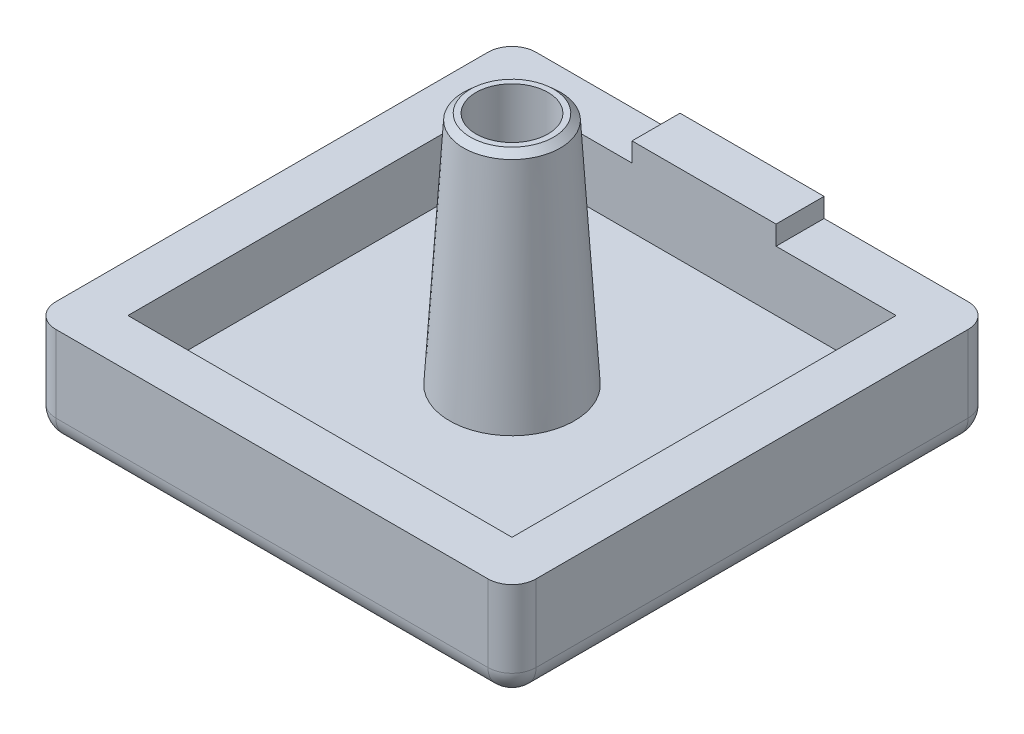
ISO-10303-21;
HEADER;
FILE_DESCRIPTION(('STEP AP214'),'2;1');
FILE_NAME('part.step','',(''),(''),'','','');
FILE_SCHEMA(('AUTOMOTIVE_DESIGN { 1 0 10303 214 1 1 1 1 }'));
ENDSEC;
DATA;
#1=APPLICATION_CONTEXT('core data for automotive mechanical design processes');
#2=APPLICATION_PROTOCOL_DEFINITION('international standard','automotive_design',2000,#1);
#3=PRODUCT_CONTEXT('',#1,'mechanical');
#4=PRODUCT('Part','Part','',(#3));
#5=PRODUCT_RELATED_PRODUCT_CATEGORY('part','',(#4));
#6=PRODUCT_DEFINITION_FORMATION('','',#4);
#7=PRODUCT_DEFINITION_CONTEXT('part definition',#1,'design');
#8=PRODUCT_DEFINITION('design','',#6,#7);
#9=PRODUCT_DEFINITION_SHAPE('','',#8);
#10=(LENGTH_UNIT() NAMED_UNIT(*) SI_UNIT(.MILLI.,.METRE.));
#11=(NAMED_UNIT(*) PLANE_ANGLE_UNIT() SI_UNIT($,.RADIAN.));
#12=(NAMED_UNIT(*) SI_UNIT($,.STERADIAN.) SOLID_ANGLE_UNIT());
#13=UNCERTAINTY_MEASURE_WITH_UNIT(LENGTH_MEASURE(1.E-05),#10,'distance_accuracy_value','');
#14=(GEOMETRIC_REPRESENTATION_CONTEXT(3) GLOBAL_UNCERTAINTY_ASSIGNED_CONTEXT((#13)) GLOBAL_UNIT_ASSIGNED_CONTEXT((#10,
#11,#12)) REPRESENTATION_CONTEXT('',''));
#15=CARTESIAN_POINT('',(0.,0.,0.));
#16=DIRECTION('',(0.,0.,1.));
#17=DIRECTION('',(1.,0.,0.));
#18=AXIS2_PLACEMENT_3D('',#15,#16,#17);
#19=CARTESIAN_POINT('',(0.,1.7,0.));
#20=DIRECTION('',(0.,1.,0.));
#21=DIRECTION('',(0.,0.,1.));
#22=AXIS2_PLACEMENT_3D('',#19,#20,#21);
#23=PLANE('',#22);
#24=CARTESIAN_POINT('',(0.,1.7,0.));
#25=DIRECTION('',(0.,1.,0.));
#26=DIRECTION('',(0.,0.,1.));
#27=AXIS2_PLACEMENT_3D('',#24,#25,#26);
#28=CIRCLE('',#27,1.5);
#29=CARTESIAN_POINT('',(0.,1.7,1.5));
#30=VERTEX_POINT('',#29);
#31=EDGE_CURVE('E20',#30,#30,#28,.T.);
#32=ORIENTED_EDGE('',*,*,#31,.T.);
#33=EDGE_LOOP('',(#32));
#34=FACE_BOUND('',#33,.T.);
#35=ADVANCED_FACE('F17',(#34),#23,.T.);
#36=CARTESIAN_POINT('',(0.,-2.54264068711929,0.));
#37=DIRECTION('',(0.,1.,0.));
#38=DIRECTION('',(0.,0.,1.));
#39=AXIS2_PLACEMENT_3D('',#36,#37,#38);
#40=CYLINDRICAL_SURFACE('',#39,1.5);
#41=CARTESIAN_POINT('',(0.,11.5,0.));
#42=DIRECTION('',(0.,1.,0.));
#43=DIRECTION('',(0.,0.,1.));
#44=AXIS2_PLACEMENT_3D('',#41,#42,#43);
#45=CIRCLE('',#44,1.5);
#46=CARTESIAN_POINT('',(0.,11.5,1.5));
#47=VERTEX_POINT('',#46);
#48=EDGE_CURVE('E281',#47,#47,#45,.F.);
#49=ORIENTED_EDGE('',*,*,#48,.F.);
#50=EDGE_LOOP('',(#49));
#51=FACE_BOUND('',#50,.T.);
#52=ORIENTED_EDGE('',*,*,#31,.F.);
#53=EDGE_LOOP('',(#52));
#54=FACE_BOUND('',#53,.T.);
#55=ADVANCED_FACE('F289',(#51,#54),#40,.F.);
#56=CARTESIAN_POINT('',(0.,11.5,0.));
#57=DIRECTION('',(0.,1.,0.));
#58=DIRECTION('',(0.,0.,1.));
#59=AXIS2_PLACEMENT_3D('',#56,#57,#58);
#60=PLANE('',#59);
#61=ORIENTED_EDGE('',*,*,#48,.T.);
#62=EDGE_LOOP('',(#61));
#63=FACE_BOUND('',#62,.T.);
#64=CARTESIAN_POINT('',(0.,11.5000000000123,0.));
#65=DIRECTION('',(0.,-1.,0.));
#66=DIRECTION('',(0.,0.,-1.));
#67=AXIS2_PLACEMENT_3D('',#64,#65,#66);
#68=CIRCLE('',#67,1.73319700638785);
#69=CARTESIAN_POINT('',(0.,11.5000000000123,-1.73319700638785));
#70=VERTEX_POINT('',#69);
#71=EDGE_CURVE('E273',#70,#70,#68,.T.);
#72=ORIENTED_EDGE('',*,*,#71,.F.);
#73=EDGE_LOOP('',(#72));
#74=FACE_BOUND('',#73,.T.);
#75=ADVANCED_FACE('F291',(#63,#74),#60,.T.);
#76=CARTESIAN_POINT('',(0.,11.2504672416662,0.));
#77=DIRECTION('',(0.,-1.,0.));
#78=DIRECTION('',(0.,0.,-1.));
#79=AXIS2_PLACEMENT_3D('',#76,#77,#78);
#80=CONICAL_SURFACE('',#79,2.01527751579533,0.846546325998921);
#81=CARTESIAN_POINT('',(0.,11.2504672416094,0.));
#82=DIRECTION('',(0.,-1.,0.));
#83=DIRECTION('',(0.,0.,-1.));
#84=AXIS2_PLACEMENT_3D('',#81,#82,#83);
#85=CIRCLE('',#84,2.01527751581665);
#86=CARTESIAN_POINT('',(0.,11.2504672416094,-2.01527751581665));
#87=VERTEX_POINT('',#86);
#88=EDGE_CURVE('E270',#87,#87,#85,.T.);
#89=ORIENTED_EDGE('',*,*,#88,.F.);
#90=EDGE_LOOP('',(#89));
#91=FACE_BOUND('',#90,.T.);
#92=ORIENTED_EDGE('',*,*,#71,.T.);
#93=EDGE_LOOP('',(#92));
#94=FACE_BOUND('',#93,.T.);
#95=ADVANCED_FACE('F298',(#91,#94),#80,.T.);
#96=CARTESIAN_POINT('',(0.,1.69999999997117,0.));
#97=DIRECTION('',(0.,-1.,0.));
#98=DIRECTION('',(0.,0.,-1.));
#99=AXIS2_PLACEMENT_3D('',#96,#97,#98);
#100=CONICAL_SURFACE('',#99,2.59999999999749,0.0611481626495508);
#101=CARTESIAN_POINT('',(0.,1.70000000002801,0.));
#102=DIRECTION('',(0.,-1.,0.));
#103=DIRECTION('',(0.,0.,-1.));
#104=AXIS2_PLACEMENT_3D('',#101,#102,#103);
#105=CIRCLE('',#104,2.59999999999401);
#106=CARTESIAN_POINT('',(0.,1.70000000002801,-2.59999999999401));
#107=VERTEX_POINT('',#106);
#108=EDGE_CURVE('E237',#107,#107,#105,.T.);
#109=ORIENTED_EDGE('',*,*,#108,.F.);
#110=EDGE_LOOP('',(#109));
#111=FACE_BOUND('',#110,.T.);
#112=ORIENTED_EDGE('',*,*,#88,.T.);
#113=EDGE_LOOP('',(#112));
#114=FACE_BOUND('',#113,.T.);
#115=ADVANCED_FACE('F518',(#111,#114),#100,.T.);
#116=CARTESIAN_POINT('',(0.,1.7,0.));
#117=DIRECTION('',(0.,1.,0.));
#118=DIRECTION('',(0.,0.,1.));
#119=AXIS2_PLACEMENT_3D('',#116,#117,#118);
#120=PLANE('',#119);
#121=ORIENTED_EDGE('',*,*,#108,.T.);
#122=EDGE_LOOP('',(#121));
#123=FACE_BOUND('',#122,.T.);
#124=DIRECTION('',(-1.,0.,0.));
#125=VECTOR('',#124,1.);
#126=CARTESIAN_POINT('',(8.,1.7,-8.));
#127=LINE('',#126,#125);
#128=CARTESIAN_POINT('',(8.,1.7,-8.));
#129=VERTEX_POINT('',#128);
#130=CARTESIAN_POINT('',(-8.,1.7,-8.));
#131=VERTEX_POINT('',#130);
#132=EDGE_CURVE('E198',#129,#131,#127,.T.);
#133=ORIENTED_EDGE('',*,*,#132,.T.);
#134=DIRECTION('',(0.,0.,1.));
#135=VECTOR('',#134,1.);
#136=CARTESIAN_POINT('',(-8.,1.7,-8.));
#137=LINE('',#136,#135);
#138=CARTESIAN_POINT('',(-8.,1.7,8.));
#139=VERTEX_POINT('',#138);
#140=EDGE_CURVE('E207',#131,#139,#137,.T.);
#141=ORIENTED_EDGE('',*,*,#140,.T.);
#142=DIRECTION('',(1.,0.,0.));
#143=VECTOR('',#142,1.);
#144=CARTESIAN_POINT('',(-8.,1.7,8.));
#145=LINE('',#144,#143);
#146=CARTESIAN_POINT('',(8.,1.7,8.));
#147=VERTEX_POINT('',#146);
#148=EDGE_CURVE('E213',#139,#147,#145,.T.);
#149=ORIENTED_EDGE('',*,*,#148,.T.);
#150=DIRECTION('',(0.,0.,-1.));
#151=VECTOR('',#150,1.);
#152=CARTESIAN_POINT('',(8.,1.7,8.));
#153=LINE('',#152,#151);
#154=EDGE_CURVE('E216',#147,#129,#153,.T.);
#155=ORIENTED_EDGE('',*,*,#154,.T.);
#156=EDGE_LOOP('',(#133,#141,#149,#155));
#157=FACE_BOUND('',#156,.T.);
#158=ADVANCED_FACE('F514',(#123,#157),#120,.T.);
#159=CARTESIAN_POINT('',(-3.,5.,-10.));
#160=DIRECTION('',(1.,0.,0.));
#161=DIRECTION('',(0.,0.,-1.));
#162=AXIS2_PLACEMENT_3D('',#159,#160,#161);
#163=PLANE('',#162);
#164=DIRECTION('',(0.,1.,0.));
#165=VECTOR('',#164,1.);
#166=CARTESIAN_POINT('',(-3.,1.7,-8.));
#167=LINE('',#166,#165);
#168=CARTESIAN_POINT('',(-3.,4.2,-8.));
#169=VERTEX_POINT('',#168);
#170=CARTESIAN_POINT('',(-3.,5.,-8.));
#171=VERTEX_POINT('',#170);
#172=EDGE_CURVE('E197',#169,#171,#167,.T.);
#173=ORIENTED_EDGE('',*,*,#172,.T.);
#174=DIRECTION('',(0.,0.,1.));
#175=VECTOR('',#174,1.);
#176=CARTESIAN_POINT('',(-3.,5.,0.));
#177=LINE('',#176,#175);
#178=CARTESIAN_POINT('',(-3.,5.,-10.));
#179=VERTEX_POINT('',#178);
#180=EDGE_CURVE('E226',#179,#171,#177,.T.);
#181=ORIENTED_EDGE('',*,*,#180,.F.);
#182=DIRECTION('',(0.,1.,0.));
#183=VECTOR('',#182,1.);
#184=CARTESIAN_POINT('',(-3.,5.,-10.));
#185=LINE('',#184,#183);
#186=CARTESIAN_POINT('',(-3.,4.2,-10.));
#187=VERTEX_POINT('',#186);
#188=EDGE_CURVE('E220',#187,#179,#185,.T.);
#189=ORIENTED_EDGE('',*,*,#188,.F.);
#190=DIRECTION('',(0.,0.,1.));
#191=VECTOR('',#190,1.);
#192=CARTESIAN_POINT('',(-3.,4.2,0.));
#193=LINE('',#192,#191);
#194=EDGE_CURVE('E162',#169,#187,#193,.F.);
#195=ORIENTED_EDGE('',*,*,#194,.F.);
#196=EDGE_LOOP('',(#173,#181,#189,#195));
#197=FACE_BOUND('',#196,.T.);
#198=ADVANCED_FACE('F510',(#197),#163,.F.);
#199=CARTESIAN_POINT('',(3.,5.,-10.));
#200=DIRECTION('',(-1.,0.,0.));
#201=DIRECTION('',(0.,0.,1.));
#202=AXIS2_PLACEMENT_3D('',#199,#200,#201);
#203=PLANE('',#202);
#204=DIRECTION('',(0.,1.,0.));
#205=VECTOR('',#204,1.);
#206=CARTESIAN_POINT('',(3.,5.,-10.));
#207=LINE('',#206,#205);
#208=CARTESIAN_POINT('',(3.,5.,-10.));
#209=VERTEX_POINT('',#208);
#210=CARTESIAN_POINT('',(3.,4.2,-10.));
#211=VERTEX_POINT('',#210);
#212=EDGE_CURVE('E218',#209,#211,#207,.F.);
#213=ORIENTED_EDGE('',*,*,#212,.F.);
#214=DIRECTION('',(0.,0.,1.));
#215=VECTOR('',#214,1.);
#216=CARTESIAN_POINT('',(3.,5.,0.));
#217=LINE('',#216,#215);
#218=CARTESIAN_POINT('',(3.,5.,-8.));
#219=VERTEX_POINT('',#218);
#220=EDGE_CURVE('E254',#219,#209,#217,.F.);
#221=ORIENTED_EDGE('',*,*,#220,.F.);
#222=DIRECTION('',(0.,1.,0.));
#223=VECTOR('',#222,1.);
#224=CARTESIAN_POINT('',(3.,1.7,-8.));
#225=LINE('',#224,#223);
#226=CARTESIAN_POINT('',(3.,4.2,-8.));
#227=VERTEX_POINT('',#226);
#228=EDGE_CURVE('E223',#219,#227,#225,.F.);
#229=ORIENTED_EDGE('',*,*,#228,.T.);
#230=DIRECTION('',(0.,0.,1.));
#231=VECTOR('',#230,1.);
#232=CARTESIAN_POINT('',(3.,4.2,0.));
#233=LINE('',#232,#231);
#234=EDGE_CURVE('E233',#211,#227,#233,.T.);
#235=ORIENTED_EDGE('',*,*,#234,.F.);
#236=EDGE_LOOP('',(#213,#221,#229,#235));
#237=FACE_BOUND('',#236,.T.);
#238=ADVANCED_FACE('F506',(#237),#203,.F.);
#239=CARTESIAN_POINT('',(8.,1.7,8.));
#240=DIRECTION('',(1.,0.,0.));
#241=DIRECTION('',(0.,0.,-1.));
#242=AXIS2_PLACEMENT_3D('',#239,#240,#241);
#243=PLANE('',#242);
#244=DIRECTION('',(0.,1.,0.));
#245=VECTOR('',#244,1.);
#246=CARTESIAN_POINT('',(8.,1.7,-8.));
#247=LINE('',#246,#245);
#248=CARTESIAN_POINT('',(8.,4.2,-8.));
#249=VERTEX_POINT('',#248);
#250=EDGE_CURVE('E201',#249,#129,#247,.F.);
#251=ORIENTED_EDGE('',*,*,#250,.T.);
#252=ORIENTED_EDGE('',*,*,#154,.F.);
#253=DIRECTION('',(0.,1.,0.));
#254=VECTOR('',#253,1.);
#255=CARTESIAN_POINT('',(8.,1.7,8.));
#256=LINE('',#255,#254);
#257=CARTESIAN_POINT('',(8.,4.2,8.));
#258=VERTEX_POINT('',#257);
#259=EDGE_CURVE('E210',#147,#258,#256,.T.);
#260=ORIENTED_EDGE('',*,*,#259,.T.);
#261=DIRECTION('',(0.,0.,1.));
#262=VECTOR('',#261,1.);
#263=CARTESIAN_POINT('',(8.,4.2,0.));
#264=LINE('',#263,#262);
#265=EDGE_CURVE('E232',#249,#258,#264,.T.);
#266=ORIENTED_EDGE('',*,*,#265,.F.);
#267=EDGE_LOOP('',(#251,#252,#260,#266));
#268=FACE_BOUND('',#267,.T.);
#269=ADVANCED_FACE('F502',(#268),#243,.F.);
#270=CARTESIAN_POINT('',(-8.,1.7,8.));
#271=DIRECTION('',(0.,0.,1.));
#272=DIRECTION('',(1.,0.,0.));
#273=AXIS2_PLACEMENT_3D('',#270,#271,#272);
#274=PLANE('',#273);
#275=ORIENTED_EDGE('',*,*,#259,.F.);
#276=ORIENTED_EDGE('',*,*,#148,.F.);
#277=DIRECTION('',(0.,1.,0.));
#278=VECTOR('',#277,1.);
#279=CARTESIAN_POINT('',(-8.,1.7,8.));
#280=LINE('',#279,#278);
#281=CARTESIAN_POINT('',(-8.,4.2,8.));
#282=VERTEX_POINT('',#281);
#283=EDGE_CURVE('E204',#139,#282,#280,.T.);
#284=ORIENTED_EDGE('',*,*,#283,.T.);
#285=DIRECTION('',(1.,0.,0.));
#286=VECTOR('',#285,1.);
#287=CARTESIAN_POINT('',(0.,4.2,8.));
#288=LINE('',#287,#286);
#289=EDGE_CURVE('E363',#258,#282,#288,.F.);
#290=ORIENTED_EDGE('',*,*,#289,.F.);
#291=EDGE_LOOP('',(#275,#276,#284,#290));
#292=FACE_BOUND('',#291,.T.);
#293=ADVANCED_FACE('F498',(#292),#274,.F.);
#294=CARTESIAN_POINT('',(-8.,1.7,-8.));
#295=DIRECTION('',(-1.,0.,0.));
#296=DIRECTION('',(0.,0.,1.));
#297=AXIS2_PLACEMENT_3D('',#294,#295,#296);
#298=PLANE('',#297);
#299=ORIENTED_EDGE('',*,*,#283,.F.);
#300=ORIENTED_EDGE('',*,*,#140,.F.);
#301=DIRECTION('',(0.,1.,0.));
#302=VECTOR('',#301,1.);
#303=CARTESIAN_POINT('',(-8.,1.7,-8.));
#304=LINE('',#303,#302);
#305=CARTESIAN_POINT('',(-8.,4.2,-8.));
#306=VERTEX_POINT('',#305);
#307=EDGE_CURVE('E194',#131,#306,#304,.T.);
#308=ORIENTED_EDGE('',*,*,#307,.T.);
#309=DIRECTION('',(0.,0.,1.));
#310=VECTOR('',#309,1.);
#311=CARTESIAN_POINT('',(-8.,4.2,0.));
#312=LINE('',#311,#310);
#313=EDGE_CURVE('E244',#282,#306,#312,.F.);
#314=ORIENTED_EDGE('',*,*,#313,.F.);
#315=EDGE_LOOP('',(#299,#300,#308,#314));
#316=FACE_BOUND('',#315,.T.);
#317=ADVANCED_FACE('F494',(#316),#298,.F.);
#318=CARTESIAN_POINT('',(8.,1.7,-8.));
#319=DIRECTION('',(0.,0.,-1.));
#320=DIRECTION('',(-1.,0.,0.));
#321=AXIS2_PLACEMENT_3D('',#318,#319,#320);
#322=PLANE('',#321);
#323=ORIENTED_EDGE('',*,*,#228,.F.);
#324=DIRECTION('',(1.,0.,0.));
#325=VECTOR('',#324,1.);
#326=CARTESIAN_POINT('',(0.,5.,-8.));
#327=LINE('',#326,#325);
#328=EDGE_CURVE('E251',#171,#219,#327,.T.);
#329=ORIENTED_EDGE('',*,*,#328,.F.);
#330=ORIENTED_EDGE('',*,*,#172,.F.);
#331=DIRECTION('',(1.,0.,0.));
#332=VECTOR('',#331,1.);
#333=CARTESIAN_POINT('',(0.,4.2,-8.));
#334=LINE('',#333,#332);
#335=EDGE_CURVE('E240',#306,#169,#334,.T.);
#336=ORIENTED_EDGE('',*,*,#335,.F.);
#337=ORIENTED_EDGE('',*,*,#307,.F.);
#338=ORIENTED_EDGE('',*,*,#132,.F.);
#339=ORIENTED_EDGE('',*,*,#250,.F.);
#340=DIRECTION('',(1.,0.,0.));
#341=VECTOR('',#340,1.);
#342=CARTESIAN_POINT('',(0.,4.2,-8.));
#343=LINE('',#342,#341);
#344=EDGE_CURVE('E229',#227,#249,#343,.T.);
#345=ORIENTED_EDGE('',*,*,#344,.F.);
#346=EDGE_LOOP('',(#323,#329,#330,#336,#337,#338,#339,#345));
#347=FACE_BOUND('',#346,.T.);
#348=ADVANCED_FACE('F488',(#347),#322,.F.);
#349=CARTESIAN_POINT('',(-9.,4.2,9.));
#350=DIRECTION('',(0.,-1.,0.));
#351=DIRECTION('',(0.,0.,-1.));
#352=AXIS2_PLACEMENT_3D('',#349,#350,#351);
#353=CYLINDRICAL_SURFACE('',#352,1.);
#354=CARTESIAN_POINT('',(-9.,4.2,9.));
#355=DIRECTION('',(0.,-1.,0.));
#356=DIRECTION('',(0.,0.,-1.));
#357=AXIS2_PLACEMENT_3D('',#354,#355,#356);
#358=CIRCLE('',#357,1.);
#359=CARTESIAN_POINT('',(-10.,4.2,9.));
#360=VERTEX_POINT('',#359);
#361=CARTESIAN_POINT('',(-9.,4.2,10.));
#362=VERTEX_POINT('',#361);
#363=EDGE_CURVE('E155',#360,#362,#358,.F.);
#364=ORIENTED_EDGE('',*,*,#363,.F.);
#365=DIRECTION('',(0.,1.,0.));
#366=VECTOR('',#365,1.);
#367=CARTESIAN_POINT('',(-10.,4.2,9.));
#368=LINE('',#367,#366);
#369=CARTESIAN_POINT('',(-10.,1.,9.));
#370=VERTEX_POINT('',#369);
#371=EDGE_CURVE('E140',#360,#370,#368,.F.);
#372=ORIENTED_EDGE('',*,*,#371,.T.);
#373=CARTESIAN_POINT('',(-9.,1.,9.));
#374=DIRECTION('',(0.,-1.,0.));
#375=DIRECTION('',(1.,0.,0.));
#376=AXIS2_PLACEMENT_3D('',#373,#374,#375);
#377=CIRCLE('',#376,1.);
#378=CARTESIAN_POINT('',(-9.,1.,10.));
#379=VERTEX_POINT('',#378);
#380=EDGE_CURVE('E166',#379,#370,#377,.T.);
#381=ORIENTED_EDGE('',*,*,#380,.F.);
#382=DIRECTION('',(0.,1.,0.));
#383=VECTOR('',#382,1.);
#384=CARTESIAN_POINT('',(-9.,4.2,10.));
#385=LINE('',#384,#383);
#386=EDGE_CURVE('E157',#379,#362,#385,.T.);
#387=ORIENTED_EDGE('',*,*,#386,.T.);
#388=EDGE_LOOP('',(#364,#372,#381,#387));
#389=FACE_BOUND('',#388,.T.);
#390=ADVANCED_FACE('F156',(#389),#353,.T.);
#391=CARTESIAN_POINT('',(9.,4.2,9.00000000000001));
#392=DIRECTION('',(0.,1.,0.));
#393=DIRECTION('',(0.,0.,1.));
#394=AXIS2_PLACEMENT_3D('',#391,#392,#393);
#395=CYLINDRICAL_SURFACE('',#394,0.999999999999999);
#396=CARTESIAN_POINT('',(9.,1.,9.));
#397=DIRECTION('',(0.,-1.,0.));
#398=DIRECTION('',(1.,0.,0.));
#399=AXIS2_PLACEMENT_3D('',#396,#397,#398);
#400=CIRCLE('',#399,1.);
#401=CARTESIAN_POINT('',(10.,1.,9.00000000000001));
#402=VERTEX_POINT('',#401);
#403=CARTESIAN_POINT('',(9.,1.,10.));
#404=VERTEX_POINT('',#403);
#405=EDGE_CURVE('E393',#402,#404,#400,.T.);
#406=ORIENTED_EDGE('',*,*,#405,.F.);
#407=DIRECTION('',(0.,1.,0.));
#408=VECTOR('',#407,1.);
#409=CARTESIAN_POINT('',(10.,4.2,9.));
#410=LINE('',#409,#408);
#411=CARTESIAN_POINT('',(10.,4.2,9.00000000000001));
#412=VERTEX_POINT('',#411);
#413=EDGE_CURVE('E177',#412,#402,#410,.F.);
#414=ORIENTED_EDGE('',*,*,#413,.F.);
#415=CARTESIAN_POINT('',(9.,4.2,9.00000000000001));
#416=DIRECTION('',(0.,1.,0.));
#417=DIRECTION('',(0.,0.,1.));
#418=AXIS2_PLACEMENT_3D('',#415,#416,#417);
#419=CIRCLE('',#418,0.999999999999999);
#420=CARTESIAN_POINT('',(9.,4.2,10.));
#421=VERTEX_POINT('',#420);
#422=EDGE_CURVE('E161',#421,#412,#419,.T.);
#423=ORIENTED_EDGE('',*,*,#422,.F.);
#424=DIRECTION('',(0.,1.,0.));
#425=VECTOR('',#424,1.);
#426=CARTESIAN_POINT('',(9.,4.2,10.));
#427=LINE('',#426,#425);
#428=EDGE_CURVE('E168',#421,#404,#427,.F.);
#429=ORIENTED_EDGE('',*,*,#428,.T.);
#430=EDGE_LOOP('',(#406,#414,#423,#429));
#431=FACE_BOUND('',#430,.T.);
#432=ADVANCED_FACE('F478',(#431),#395,.T.);
#433=CARTESIAN_POINT('',(0.,5.,0.));
#434=DIRECTION('',(0.,1.,0.));
#435=DIRECTION('',(0.,0.,1.));
#436=AXIS2_PLACEMENT_3D('',#433,#434,#435);
#437=PLANE('',#436);
#438=ORIENTED_EDGE('',*,*,#220,.T.);
#439=DIRECTION('',(-1.,0.,0.));
#440=VECTOR('',#439,1.);
#441=CARTESIAN_POINT('',(-10.,5.,-10.));
#442=LINE('',#441,#440);
#443=EDGE_CURVE('E264',#179,#209,#442,.F.);
#444=ORIENTED_EDGE('',*,*,#443,.F.);
#445=ORIENTED_EDGE('',*,*,#180,.T.);
#446=ORIENTED_EDGE('',*,*,#328,.T.);
#447=EDGE_LOOP('',(#438,#444,#445,#446));
#448=FACE_BOUND('',#447,.T.);
#449=ADVANCED_FACE('F480',(#448),#437,.T.);
#450=CARTESIAN_POINT('',(0.,4.2,0.));
#451=DIRECTION('',(0.,1.,0.));
#452=DIRECTION('',(0.,0.,1.));
#453=AXIS2_PLACEMENT_3D('',#450,#451,#452);
#454=PLANE('',#453);
#455=ORIENTED_EDGE('',*,*,#313,.T.);
#456=ORIENTED_EDGE('',*,*,#335,.T.);
#457=ORIENTED_EDGE('',*,*,#194,.T.);
#458=DIRECTION('',(-1.,0.,0.));
#459=VECTOR('',#458,1.);
#460=CARTESIAN_POINT('',(-10.,4.2,-10.));
#461=LINE('',#460,#459);
#462=CARTESIAN_POINT('',(-9.,4.2,-10.));
#463=VERTEX_POINT('',#462);
#464=EDGE_CURVE('E176',#463,#187,#461,.F.);
#465=ORIENTED_EDGE('',*,*,#464,.F.);
#466=CARTESIAN_POINT('',(-9.,4.2,-9.));
#467=DIRECTION('',(0.,1.,0.));
#468=DIRECTION('',(0.,0.,1.));
#469=AXIS2_PLACEMENT_3D('',#466,#467,#468);
#470=CIRCLE('',#469,1.);
#471=CARTESIAN_POINT('',(-10.,4.2,-9.));
#472=VERTEX_POINT('',#471);
#473=EDGE_CURVE('E151',#472,#463,#470,.F.);
#474=ORIENTED_EDGE('',*,*,#473,.F.);
#475=DIRECTION('',(0.,0.,-1.));
#476=VECTOR('',#475,1.);
#477=CARTESIAN_POINT('',(-10.,4.2,-10.));
#478=LINE('',#477,#476);
#479=EDGE_CURVE('E144',#472,#360,#478,.F.);
#480=ORIENTED_EDGE('',*,*,#479,.T.);
#481=ORIENTED_EDGE('',*,*,#363,.T.);
#482=DIRECTION('',(-1.,0.,0.));
#483=VECTOR('',#482,1.);
#484=CARTESIAN_POINT('',(-10.,4.2,10.));
#485=LINE('',#484,#483);
#486=EDGE_CURVE('E413',#362,#421,#485,.F.);
#487=ORIENTED_EDGE('',*,*,#486,.T.);
#488=ORIENTED_EDGE('',*,*,#422,.T.);
#489=DIRECTION('',(0.,0.,-1.));
#490=VECTOR('',#489,1.);
#491=CARTESIAN_POINT('',(10.,4.2,-10.));
#492=LINE('',#491,#490);
#493=CARTESIAN_POINT('',(10.,4.2,-9.));
#494=VERTEX_POINT('',#493);
#495=EDGE_CURVE('E392',#494,#412,#492,.F.);
#496=ORIENTED_EDGE('',*,*,#495,.F.);
#497=CARTESIAN_POINT('',(9.,4.2,-9.));
#498=DIRECTION('',(0.,-1.,0.));
#499=DIRECTION('',(0.,0.,-1.));
#500=AXIS2_PLACEMENT_3D('',#497,#498,#499);
#501=CIRCLE('',#500,1.);
#502=CARTESIAN_POINT('',(9.,4.2,-10.));
#503=VERTEX_POINT('',#502);
#504=EDGE_CURVE('E243',#503,#494,#501,.T.);
#505=ORIENTED_EDGE('',*,*,#504,.F.);
#506=DIRECTION('',(-1.,0.,0.));
#507=VECTOR('',#506,1.);
#508=CARTESIAN_POINT('',(-10.,4.2,-10.));
#509=LINE('',#508,#507);
#510=EDGE_CURVE('E267',#211,#503,#509,.F.);
#511=ORIENTED_EDGE('',*,*,#510,.F.);
#512=ORIENTED_EDGE('',*,*,#234,.T.);
#513=ORIENTED_EDGE('',*,*,#344,.T.);
#514=ORIENTED_EDGE('',*,*,#265,.T.);
#515=ORIENTED_EDGE('',*,*,#289,.T.);
#516=EDGE_LOOP('',(#455,#456,#457,#465,#474,#480,#481,#487,#488,#496,#505,#511,#512,#513,#514,#515));
#517=FACE_BOUND('',#516,.T.);
#518=ADVANCED_FACE('F164',(#517),#454,.T.);
#519=CARTESIAN_POINT('',(9.,4.2,-9.));
#520=DIRECTION('',(0.,-1.,0.));
#521=DIRECTION('',(0.,0.,-1.));
#522=AXIS2_PLACEMENT_3D('',#519,#520,#521);
#523=CYLINDRICAL_SURFACE('',#522,1.);
#524=CARTESIAN_POINT('',(9.,1.,-9.));
#525=DIRECTION('',(0.,-1.,0.));
#526=DIRECTION('',(0.,0.,-1.));
#527=AXIS2_PLACEMENT_3D('',#524,#525,#526);
#528=CIRCLE('',#527,1.);
#529=CARTESIAN_POINT('',(10.,1.,-9.));
#530=VERTEX_POINT('',#529);
#531=CARTESIAN_POINT('',(9.,1.,-10.));
#532=VERTEX_POINT('',#531);
#533=EDGE_CURVE('E275',#530,#532,#528,.F.);
#534=ORIENTED_EDGE('',*,*,#533,.T.);
#535=DIRECTION('',(0.,1.,0.));
#536=VECTOR('',#535,1.);
#537=CARTESIAN_POINT('',(9.,4.2,-10.));
#538=LINE('',#537,#536);
#539=EDGE_CURVE('E367',#503,#532,#538,.F.);
#540=ORIENTED_EDGE('',*,*,#539,.F.);
#541=ORIENTED_EDGE('',*,*,#504,.T.);
#542=DIRECTION('',(0.,1.,0.));
#543=VECTOR('',#542,1.);
#544=CARTESIAN_POINT('',(10.,4.2,-9.));
#545=LINE('',#544,#543);
#546=EDGE_CURVE('E389',#530,#494,#545,.T.);
#547=ORIENTED_EDGE('',*,*,#546,.F.);
#548=EDGE_LOOP('',(#534,#540,#541,#547));
#549=FACE_BOUND('',#548,.T.);
#550=ADVANCED_FACE('F594',(#549),#523,.T.);
#551=CARTESIAN_POINT('',(-9.,4.2,-9.));
#552=DIRECTION('',(0.,1.,0.));
#553=DIRECTION('',(0.,0.,1.));
#554=AXIS2_PLACEMENT_3D('',#551,#552,#553);
#555=CYLINDRICAL_SURFACE('',#554,1.);
#556=CARTESIAN_POINT('',(-9.,1.,-9.));
#557=DIRECTION('',(0.,1.,0.));
#558=DIRECTION('',(1.,0.,0.));
#559=AXIS2_PLACEMENT_3D('',#556,#557,#558);
#560=CIRCLE('',#559,1.);
#561=CARTESIAN_POINT('',(-10.,1.,-9.));
#562=VERTEX_POINT('',#561);
#563=CARTESIAN_POINT('',(-9.,1.,-10.));
#564=VERTEX_POINT('',#563);
#565=EDGE_CURVE('E174',#562,#564,#560,.F.);
#566=ORIENTED_EDGE('',*,*,#565,.F.);
#567=DIRECTION('',(0.,1.,0.));
#568=VECTOR('',#567,1.);
#569=CARTESIAN_POINT('',(-10.,4.2,-9.));
#570=LINE('',#569,#568);
#571=EDGE_CURVE('E150',#562,#472,#570,.T.);
#572=ORIENTED_EDGE('',*,*,#571,.T.);
#573=ORIENTED_EDGE('',*,*,#473,.T.);
#574=DIRECTION('',(0.,1.,0.));
#575=VECTOR('',#574,1.);
#576=CARTESIAN_POINT('',(-9.,4.2,-10.));
#577=LINE('',#576,#575);
#578=EDGE_CURVE('E372',#564,#463,#577,.T.);
#579=ORIENTED_EDGE('',*,*,#578,.F.);
#580=EDGE_LOOP('',(#566,#572,#573,#579));
#581=FACE_BOUND('',#580,.T.);
#582=ADVANCED_FACE('F454',(#581),#555,.T.);
#583=CARTESIAN_POINT('',(-10.,4.2,-10.));
#584=DIRECTION('',(1.,0.,0.));
#585=DIRECTION('',(0.,0.,-1.));
#586=AXIS2_PLACEMENT_3D('',#583,#584,#585);
#587=PLANE('',#586);
#588=ORIENTED_EDGE('',*,*,#571,.F.);
#589=DIRECTION('',(0.,0.,1.));
#590=VECTOR('',#589,1.);
#591=CARTESIAN_POINT('',(-10.,1.,-10.));
#592=LINE('',#591,#590);
#593=EDGE_CURVE('E147',#370,#562,#592,.F.);
#594=ORIENTED_EDGE('',*,*,#593,.F.);
#595=ORIENTED_EDGE('',*,*,#371,.F.);
#596=ORIENTED_EDGE('',*,*,#479,.F.);
#597=EDGE_LOOP('',(#588,#594,#595,#596));
#598=FACE_BOUND('',#597,.T.);
#599=ADVANCED_FACE('F142',(#598),#587,.F.);
#600=CARTESIAN_POINT('',(-9.,1.,9.));
#601=DIRECTION('',(1.,0.,0.));
#602=DIRECTION('',(0.,0.,-1.));
#603=AXIS2_PLACEMENT_3D('',#600,#601,#602);
#604=SPHERICAL_SURFACE('',#603,1.);
#605=ORIENTED_EDGE('',*,*,#380,.T.);
#606=CARTESIAN_POINT('',(-9.,1.,9.));
#607=DIRECTION('',(0.,0.,1.));
#608=DIRECTION('',(1.,0.,0.));
#609=AXIS2_PLACEMENT_3D('',#606,#607,#608);
#610=CIRCLE('',#609,1.);
#611=CARTESIAN_POINT('',(-9.,0.,9.00000000000001));
#612=VERTEX_POINT('',#611);
#613=EDGE_CURVE('E380',#612,#370,#610,.F.);
#614=ORIENTED_EDGE('',*,*,#613,.F.);
#615=CARTESIAN_POINT('',(-9.,1.,9.));
#616=DIRECTION('',(1.,0.,0.));
#617=DIRECTION('',(0.,0.,-1.));
#618=AXIS2_PLACEMENT_3D('',#615,#616,#617);
#619=CIRCLE('',#618,1.);
#620=EDGE_CURVE('E182',#379,#612,#619,.T.);
#621=ORIENTED_EDGE('',*,*,#620,.F.);
#622=EDGE_LOOP('',(#605,#614,#621));
#623=FACE_BOUND('',#622,.T.);
#624=ADVANCED_FACE('F354',(#623),#604,.T.);
#625=CARTESIAN_POINT('',(-10.,4.2,10.));
#626=DIRECTION('',(0.,0.,-1.));
#627=DIRECTION('',(-1.,0.,0.));
#628=AXIS2_PLACEMENT_3D('',#625,#626,#627);
#629=PLANE('',#628);
#630=ORIENTED_EDGE('',*,*,#386,.F.);
#631=DIRECTION('',(1.,0.,0.));
#632=VECTOR('',#631,1.);
#633=CARTESIAN_POINT('',(-10.,1.,10.));
#634=LINE('',#633,#632);
#635=EDGE_CURVE('E423',#404,#379,#634,.F.);
#636=ORIENTED_EDGE('',*,*,#635,.F.);
#637=ORIENTED_EDGE('',*,*,#428,.F.);
#638=ORIENTED_EDGE('',*,*,#486,.F.);
#639=EDGE_LOOP('',(#630,#636,#637,#638));
#640=FACE_BOUND('',#639,.T.);
#641=ADVANCED_FACE('F350',(#640),#629,.F.);
#642=CARTESIAN_POINT('',(9.,1.,9.));
#643=DIRECTION('',(1.,0.,0.));
#644=DIRECTION('',(0.,0.,-1.));
#645=AXIS2_PLACEMENT_3D('',#642,#643,#644);
#646=SPHERICAL_SURFACE('',#645,1.);
#647=CARTESIAN_POINT('',(9.,1.,9.));
#648=DIRECTION('',(1.,0.,0.));
#649=DIRECTION('',(0.,0.,-1.));
#650=AXIS2_PLACEMENT_3D('',#647,#648,#649);
#651=CIRCLE('',#650,1.);
#652=CARTESIAN_POINT('',(9.,0.,9.00000000000001));
#653=VERTEX_POINT('',#652);
#654=EDGE_CURVE('E426',#653,#404,#651,.F.);
#655=ORIENTED_EDGE('',*,*,#654,.F.);
#656=CARTESIAN_POINT('',(9.,1.,9.00000000000001));
#657=DIRECTION('',(0.,0.,-1.));
#658=DIRECTION('',(-1.,0.,0.));
#659=AXIS2_PLACEMENT_3D('',#656,#657,#658);
#660=CIRCLE('',#659,1.);
#661=EDGE_CURVE('E333',#402,#653,#660,.T.);
#662=ORIENTED_EDGE('',*,*,#661,.F.);
#663=ORIENTED_EDGE('',*,*,#405,.T.);
#664=EDGE_LOOP('',(#655,#662,#663));
#665=FACE_BOUND('',#664,.T.);
#666=ADVANCED_FACE('F346',(#665),#646,.T.);
#667=CARTESIAN_POINT('',(10.,4.2,-10.));
#668=DIRECTION('',(1.,0.,0.));
#669=DIRECTION('',(0.,0.,-1.));
#670=AXIS2_PLACEMENT_3D('',#667,#668,#669);
#671=PLANE('',#670);
#672=ORIENTED_EDGE('',*,*,#495,.T.);
#673=ORIENTED_EDGE('',*,*,#413,.T.);
#674=DIRECTION('',(0.,0.,-1.));
#675=VECTOR('',#674,1.);
#676=CARTESIAN_POINT('',(10.,1.,0.));
#677=LINE('',#676,#675);
#678=EDGE_CURVE('E405',#530,#402,#677,.F.);
#679=ORIENTED_EDGE('',*,*,#678,.F.);
#680=ORIENTED_EDGE('',*,*,#546,.T.);
#681=EDGE_LOOP('',(#672,#673,#679,#680));
#682=FACE_BOUND('',#681,.T.);
#683=ADVANCED_FACE('F342',(#682),#671,.T.);
#684=CARTESIAN_POINT('',(-9.,1.,-9.));
#685=DIRECTION('',(1.,0.,0.));
#686=DIRECTION('',(0.,0.,-1.));
#687=AXIS2_PLACEMENT_3D('',#684,#685,#686);
#688=SPHERICAL_SURFACE('',#687,1.);
#689=ORIENTED_EDGE('',*,*,#565,.T.);
#690=CARTESIAN_POINT('',(-9.,1.,-9.));
#691=DIRECTION('',(-1.,0.,0.));
#692=DIRECTION('',(0.,0.,1.));
#693=AXIS2_PLACEMENT_3D('',#690,#691,#692);
#694=CIRCLE('',#693,1.);
#695=CARTESIAN_POINT('',(-9.,0.,-9.));
#696=VERTEX_POINT('',#695);
#697=EDGE_CURVE('E187',#696,#564,#694,.F.);
#698=ORIENTED_EDGE('',*,*,#697,.F.);
#699=CARTESIAN_POINT('',(-9.,1.,-9.));
#700=DIRECTION('',(0.,0.,1.));
#701=DIRECTION('',(1.,0.,0.));
#702=AXIS2_PLACEMENT_3D('',#699,#700,#701);
#703=CIRCLE('',#702,1.);
#704=EDGE_CURVE('E180',#562,#696,#703,.T.);
#705=ORIENTED_EDGE('',*,*,#704,.F.);
#706=EDGE_LOOP('',(#689,#698,#705));
#707=FACE_BOUND('',#706,.T.);
#708=ADVANCED_FACE('F339',(#707),#688,.T.);
#709=CARTESIAN_POINT('',(-10.,4.2,-10.));
#710=DIRECTION('',(0.,0.,-1.));
#711=DIRECTION('',(-1.,0.,0.));
#712=AXIS2_PLACEMENT_3D('',#709,#710,#711);
#713=PLANE('',#712);
#714=DIRECTION('',(-1.,0.,0.));
#715=VECTOR('',#714,1.);
#716=CARTESIAN_POINT('',(0.,1.,-10.));
#717=LINE('',#716,#715);
#718=EDGE_CURVE('E185',#564,#532,#717,.F.);
#719=ORIENTED_EDGE('',*,*,#718,.F.);
#720=ORIENTED_EDGE('',*,*,#578,.T.);
#721=ORIENTED_EDGE('',*,*,#464,.T.);
#722=ORIENTED_EDGE('',*,*,#188,.T.);
#723=ORIENTED_EDGE('',*,*,#443,.T.);
#724=ORIENTED_EDGE('',*,*,#212,.T.);
#725=ORIENTED_EDGE('',*,*,#510,.T.);
#726=ORIENTED_EDGE('',*,*,#539,.T.);
#727=EDGE_LOOP('',(#719,#720,#721,#722,#723,#724,#725,#726));
#728=FACE_BOUND('',#727,.T.);
#729=ADVANCED_FACE('F327',(#728),#713,.T.);
#730=CARTESIAN_POINT('',(9.,1.,-9.));
#731=DIRECTION('',(1.,0.,0.));
#732=DIRECTION('',(0.,0.,-1.));
#733=AXIS2_PLACEMENT_3D('',#730,#731,#732);
#734=SPHERICAL_SURFACE('',#733,1.);
#735=CARTESIAN_POINT('',(9.,1.,-9.));
#736=DIRECTION('',(-1.,0.,0.));
#737=DIRECTION('',(0.,0.,1.));
#738=AXIS2_PLACEMENT_3D('',#735,#736,#737);
#739=CIRCLE('',#738,1.);
#740=CARTESIAN_POINT('',(9.,0.,-9.));
#741=VERTEX_POINT('',#740);
#742=EDGE_CURVE('E34',#532,#741,#739,.T.);
#743=ORIENTED_EDGE('',*,*,#742,.F.);
#744=ORIENTED_EDGE('',*,*,#533,.F.);
#745=CARTESIAN_POINT('',(9.,1.,-9.));
#746=DIRECTION('',(0.,0.,-1.));
#747=DIRECTION('',(-1.,0.,0.));
#748=AXIS2_PLACEMENT_3D('',#745,#746,#747);
#749=CIRCLE('',#748,1.);
#750=EDGE_CURVE('E402',#741,#530,#749,.F.);
#751=ORIENTED_EDGE('',*,*,#750,.F.);
#752=EDGE_LOOP('',(#743,#744,#751));
#753=FACE_BOUND('',#752,.T.);
#754=ADVANCED_FACE('F322',(#753),#734,.T.);
#755=CARTESIAN_POINT('',(-9.,1.,-10.));
#756=DIRECTION('',(0.,0.,1.));
#757=DIRECTION('',(1.,0.,0.));
#758=AXIS2_PLACEMENT_3D('',#755,#756,#757);
#759=CYLINDRICAL_SURFACE('',#758,1.);
#760=ORIENTED_EDGE('',*,*,#704,.T.);
#761=DIRECTION('',(0.,0.,1.));
#762=VECTOR('',#761,1.);
#763=CARTESIAN_POINT('',(-9.,0.,0.));
#764=LINE('',#763,#762);
#765=EDGE_CURVE('E191',#696,#612,#764,.T.);
#766=ORIENTED_EDGE('',*,*,#765,.T.);
#767=ORIENTED_EDGE('',*,*,#613,.T.);
#768=ORIENTED_EDGE('',*,*,#593,.T.);
#769=EDGE_LOOP('',(#760,#766,#767,#768));
#770=FACE_BOUND('',#769,.T.);
#771=ADVANCED_FACE('F318',(#770),#759,.T.);
#772=CARTESIAN_POINT('',(-10.,1.,9.));
#773=DIRECTION('',(1.,0.,0.));
#774=DIRECTION('',(0.,0.,-1.));
#775=AXIS2_PLACEMENT_3D('',#772,#773,#774);
#776=CYLINDRICAL_SURFACE('',#775,1.);
#777=ORIENTED_EDGE('',*,*,#654,.T.);
#778=ORIENTED_EDGE('',*,*,#635,.T.);
#779=ORIENTED_EDGE('',*,*,#620,.T.);
#780=DIRECTION('',(1.,0.,0.));
#781=VECTOR('',#780,1.);
#782=CARTESIAN_POINT('',(0.,0.,9.));
#783=LINE('',#782,#781);
#784=EDGE_CURVE('E465',#612,#653,#783,.T.);
#785=ORIENTED_EDGE('',*,*,#784,.T.);
#786=EDGE_LOOP('',(#777,#778,#779,#785));
#787=FACE_BOUND('',#786,.T.);
#788=ADVANCED_FACE('F314',(#787),#776,.T.);
#789=CARTESIAN_POINT('',(9.,1.,0.));
#790=DIRECTION('',(0.,0.,-1.));
#791=DIRECTION('',(-1.,0.,0.));
#792=AXIS2_PLACEMENT_3D('',#789,#790,#791);
#793=CYLINDRICAL_SURFACE('',#792,1.);
#794=ORIENTED_EDGE('',*,*,#750,.T.);
#795=ORIENTED_EDGE('',*,*,#678,.T.);
#796=ORIENTED_EDGE('',*,*,#661,.T.);
#797=DIRECTION('',(0.,0.,1.));
#798=VECTOR('',#797,1.);
#799=CARTESIAN_POINT('',(9.,0.,0.));
#800=LINE('',#799,#798);
#801=EDGE_CURVE('E26',#653,#741,#800,.F.);
#802=ORIENTED_EDGE('',*,*,#801,.T.);
#803=EDGE_LOOP('',(#794,#795,#796,#802));
#804=FACE_BOUND('',#803,.T.);
#805=ADVANCED_FACE('F308',(#804),#793,.T.);
#806=CARTESIAN_POINT('',(0.,1.,-9.));
#807=DIRECTION('',(-1.,0.,0.));
#808=DIRECTION('',(0.,0.,1.));
#809=AXIS2_PLACEMENT_3D('',#806,#807,#808);
#810=CYLINDRICAL_SURFACE('',#809,1.);
#811=ORIENTED_EDGE('',*,*,#742,.T.);
#812=DIRECTION('',(1.,0.,0.));
#813=VECTOR('',#812,1.);
#814=CARTESIAN_POINT('',(0.,0.,-9.));
#815=LINE('',#814,#813);
#816=EDGE_CURVE('E10',#741,#696,#815,.F.);
#817=ORIENTED_EDGE('',*,*,#816,.T.);
#818=ORIENTED_EDGE('',*,*,#697,.T.);
#819=ORIENTED_EDGE('',*,*,#718,.T.);
#820=EDGE_LOOP('',(#811,#817,#818,#819));
#821=FACE_BOUND('',#820,.T.);
#822=ADVANCED_FACE('F302',(#821),#810,.T.);
#823=CARTESIAN_POINT('',(0.,0.,0.));
#824=DIRECTION('',(0.,1.,0.));
#825=DIRECTION('',(0.,0.,1.));
#826=AXIS2_PLACEMENT_3D('',#823,#824,#825);
#827=PLANE('',#826);
#828=ORIENTED_EDGE('',*,*,#801,.F.);
#829=ORIENTED_EDGE('',*,*,#784,.F.);
#830=ORIENTED_EDGE('',*,*,#765,.F.);
#831=ORIENTED_EDGE('',*,*,#816,.F.);
#832=EDGE_LOOP('',(#828,#829,#830,#831));
#833=FACE_BOUND('',#832,.T.);
#834=ADVANCED_FACE('F300',(#833),#827,.F.);
#835=CLOSED_SHELL('',(#35,#55,#75,#95,#115,#158,#198,#238,#269,#293,#317,#348,#390,#432,#449,
#518,#550,#582,#599,#624,#641,#666,#683,#708,#729,#754,#771,#788,#805,#822,#834));
#836=MANIFOLD_SOLID_BREP('B1',#835);
#837=ADVANCED_BREP_SHAPE_REPRESENTATION('',(#18,#836),#14);
#838=SHAPE_DEFINITION_REPRESENTATION(#9,#837);
ENDSEC;
END-ISO-10303-21;
